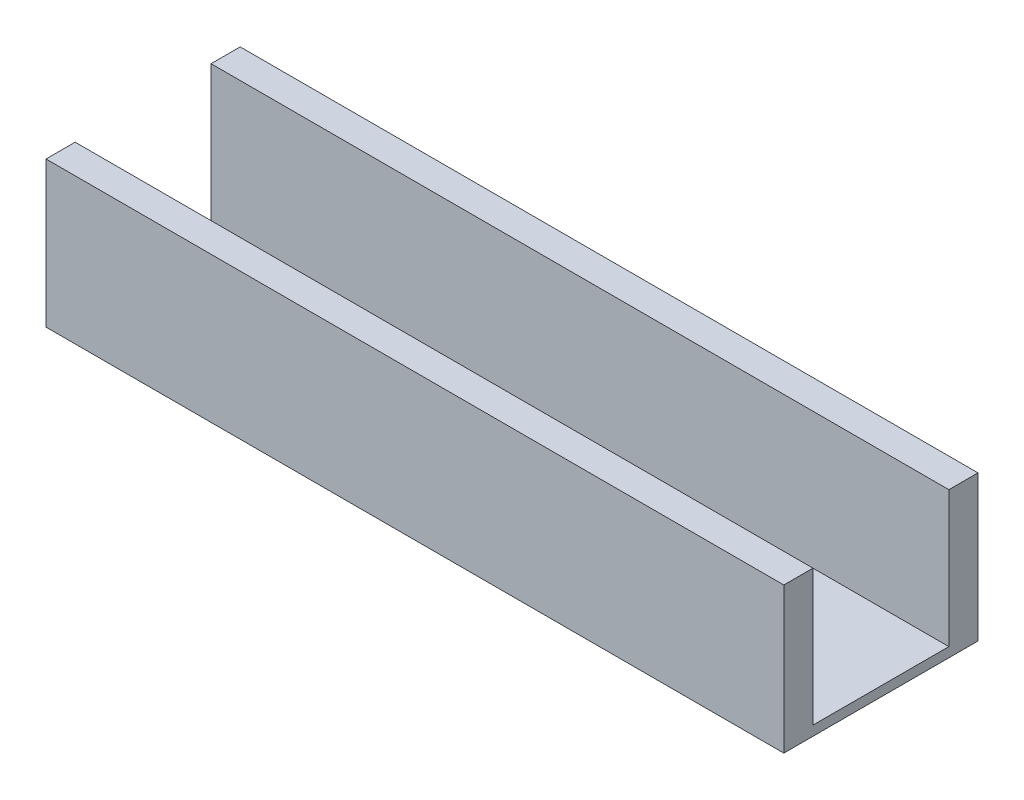
ISO-10303-21;
HEADER;
FILE_DESCRIPTION(('STEP AP214'),'2;1');
FILE_NAME('part.step','',(''),(''),'','','');
FILE_SCHEMA(('AUTOMOTIVE_DESIGN { 1 0 10303 214 1 1 1 1 }'));
ENDSEC;
DATA;
#1=APPLICATION_CONTEXT('core data for automotive mechanical design processes');
#2=APPLICATION_PROTOCOL_DEFINITION('international standard','automotive_design',2000,#1);
#3=PRODUCT_CONTEXT('',#1,'mechanical');
#4=PRODUCT('Part','Part','',(#3));
#5=PRODUCT_RELATED_PRODUCT_CATEGORY('part','',(#4));
#6=PRODUCT_DEFINITION_FORMATION('','',#4);
#7=PRODUCT_DEFINITION_CONTEXT('part definition',#1,'design');
#8=PRODUCT_DEFINITION('design','',#6,#7);
#9=PRODUCT_DEFINITION_SHAPE('','',#8);
#10=(LENGTH_UNIT() NAMED_UNIT(*) SI_UNIT(.MILLI.,.METRE.));
#11=(NAMED_UNIT(*) PLANE_ANGLE_UNIT() SI_UNIT($,.RADIAN.));
#12=(NAMED_UNIT(*) SI_UNIT($,.STERADIAN.) SOLID_ANGLE_UNIT());
#13=UNCERTAINTY_MEASURE_WITH_UNIT(LENGTH_MEASURE(1.E-05),#10,'distance_accuracy_value','');
#14=(GEOMETRIC_REPRESENTATION_CONTEXT(3) GLOBAL_UNCERTAINTY_ASSIGNED_CONTEXT((#13)) GLOBAL_UNIT_ASSIGNED_CONTEXT((#10,
#11,#12)) REPRESENTATION_CONTEXT('',''));
#15=CARTESIAN_POINT('',(0.,0.,0.));
#16=DIRECTION('',(0.,0.,1.));
#17=DIRECTION('',(1.,0.,0.));
#18=AXIS2_PLACEMENT_3D('',#15,#16,#17);
#19=CARTESIAN_POINT('',(0.,6.35,0.));
#20=DIRECTION('',(0.,-1.,0.));
#21=DIRECTION('',(0.,0.,-1.));
#22=AXIS2_PLACEMENT_3D('',#19,#20,#21);
#23=PLANE('',#22);
#24=DIRECTION('',(1.,0.,0.));
#25=VECTOR('',#24,1.);
#26=CARTESIAN_POINT('',(0.,6.35,-107.95));
#27=LINE('',#26,#25);
#28=CARTESIAN_POINT('',(0.,6.35,-107.95));
#29=VERTEX_POINT('',#28);
#30=CARTESIAN_POINT('',(482.6,6.35,-107.95));
#31=VERTEX_POINT('',#30);
#32=EDGE_CURVE('E122',#29,#31,#27,.T.);
#33=ORIENTED_EDGE('',*,*,#32,.F.);
#34=DIRECTION('',(0.,0.,1.));
#35=VECTOR('',#34,1.);
#36=CARTESIAN_POINT('',(0.,6.35,0.));
#37=LINE('',#36,#35);
#38=CARTESIAN_POINT('',(0.,6.35,-19.05));
#39=VERTEX_POINT('',#38);
#40=EDGE_CURVE('E126',#29,#39,#37,.T.);
#41=ORIENTED_EDGE('',*,*,#40,.T.);
#42=DIRECTION('',(-1.,0.,0.));
#43=VECTOR('',#42,1.);
#44=CARTESIAN_POINT('',(0.,6.35,-19.05));
#45=LINE('',#44,#43);
#46=CARTESIAN_POINT('',(482.6,6.35,-19.05));
#47=VERTEX_POINT('',#46);
#48=EDGE_CURVE('E58',#47,#39,#45,.T.);
#49=ORIENTED_EDGE('',*,*,#48,.F.);
#50=DIRECTION('',(0.,0.,-1.));
#51=VECTOR('',#50,1.);
#52=CARTESIAN_POINT('',(482.6,6.35,-127.));
#53=LINE('',#52,#51);
#54=EDGE_CURVE('E53',#47,#31,#53,.T.);
#55=ORIENTED_EDGE('',*,*,#54,.T.);
#56=EDGE_LOOP('',(#33,#41,#49,#55));
#57=FACE_BOUND('',#56,.T.);
#58=ADVANCED_FACE('F38',(#57),#23,.F.);
#59=CARTESIAN_POINT('',(482.6,6.35,0.));
#60=DIRECTION('',(0.,0.,-1.));
#61=DIRECTION('',(-1.,0.,0.));
#62=AXIS2_PLACEMENT_3D('',#59,#60,#61);
#63=PLANE('',#62);
#64=DIRECTION('',(1.,0.,0.));
#65=VECTOR('',#64,1.);
#66=CARTESIAN_POINT('',(482.6,0.,0.));
#67=LINE('',#66,#65);
#68=CARTESIAN_POINT('',(0.,0.,0.));
#69=VERTEX_POINT('',#68);
#70=CARTESIAN_POINT('',(482.6,0.,0.));
#71=VERTEX_POINT('',#70);
#72=EDGE_CURVE('E147',#69,#71,#67,.T.);
#73=ORIENTED_EDGE('',*,*,#72,.T.);
#74=DIRECTION('',(0.,-1.,0.));
#75=VECTOR('',#74,1.);
#76=CARTESIAN_POINT('',(482.6,6.35,0.));
#77=LINE('',#76,#75);
#78=CARTESIAN_POINT('',(482.6,95.25,0.));
#79=VERTEX_POINT('',#78);
#80=EDGE_CURVE('E11',#79,#71,#77,.T.);
#81=ORIENTED_EDGE('',*,*,#80,.F.);
#82=DIRECTION('',(1.,0.,0.));
#83=VECTOR('',#82,1.);
#84=CARTESIAN_POINT('',(0.,95.25,0.));
#85=LINE('',#84,#83);
#86=CARTESIAN_POINT('',(0.,95.25,0.));
#87=VERTEX_POINT('',#86);
#88=EDGE_CURVE('E135',#87,#79,#85,.T.);
#89=ORIENTED_EDGE('',*,*,#88,.F.);
#90=DIRECTION('',(0.,-1.,0.));
#91=VECTOR('',#90,1.);
#92=CARTESIAN_POINT('',(0.,6.35,0.));
#93=LINE('',#92,#91);
#94=EDGE_CURVE('E151',#87,#69,#93,.T.);
#95=ORIENTED_EDGE('',*,*,#94,.T.);
#96=EDGE_LOOP('',(#73,#81,#89,#95));
#97=FACE_BOUND('',#96,.T.);
#98=ADVANCED_FACE('F40',(#97),#63,.F.);
#99=CARTESIAN_POINT('',(482.6,6.35,-127.));
#100=DIRECTION('',(-1.,0.,0.));
#101=DIRECTION('',(0.,0.,1.));
#102=AXIS2_PLACEMENT_3D('',#99,#100,#101);
#103=PLANE('',#102);
#104=DIRECTION('',(0.,0.,-1.));
#105=VECTOR('',#104,1.);
#106=CARTESIAN_POINT('',(482.6,0.,-127.));
#107=LINE('',#106,#105);
#108=CARTESIAN_POINT('',(482.6,0.,-127.));
#109=VERTEX_POINT('',#108);
#110=EDGE_CURVE('E154',#71,#109,#107,.T.);
#111=ORIENTED_EDGE('',*,*,#110,.T.);
#112=DIRECTION('',(0.,-1.,0.));
#113=VECTOR('',#112,1.);
#114=CARTESIAN_POINT('',(482.6,6.35,-127.));
#115=LINE('',#114,#113);
#116=CARTESIAN_POINT('',(482.6,95.25,-127.));
#117=VERTEX_POINT('',#116);
#118=EDGE_CURVE('E46',#117,#109,#115,.T.);
#119=ORIENTED_EDGE('',*,*,#118,.F.);
#120=DIRECTION('',(0.,0.,-1.));
#121=VECTOR('',#120,1.);
#122=CARTESIAN_POINT('',(482.6,95.25,-127.));
#123=LINE('',#122,#121);
#124=CARTESIAN_POINT('',(482.6,95.25,-107.95));
#125=VERTEX_POINT('',#124);
#126=EDGE_CURVE('E112',#125,#117,#123,.T.);
#127=ORIENTED_EDGE('',*,*,#126,.F.);
#128=DIRECTION('',(0.,-1.,0.));
#129=VECTOR('',#128,1.);
#130=CARTESIAN_POINT('',(482.6,95.25,-107.95));
#131=LINE('',#130,#129);
#132=EDGE_CURVE('E108',#125,#31,#131,.T.);
#133=ORIENTED_EDGE('',*,*,#132,.T.);
#134=ORIENTED_EDGE('',*,*,#54,.F.);
#135=DIRECTION('',(0.,-1.,0.));
#136=VECTOR('',#135,1.);
#137=CARTESIAN_POINT('',(482.6,95.25,-19.05));
#138=LINE('',#137,#136);
#139=CARTESIAN_POINT('',(482.6,95.25,-19.05));
#140=VERTEX_POINT('',#139);
#141=EDGE_CURVE('E144',#140,#47,#138,.T.);
#142=ORIENTED_EDGE('',*,*,#141,.F.);
#143=DIRECTION('',(0.,0.,-1.));
#144=VECTOR('',#143,1.);
#145=CARTESIAN_POINT('',(482.6,95.25,0.));
#146=LINE('',#145,#144);
#147=EDGE_CURVE('E138',#79,#140,#146,.T.);
#148=ORIENTED_EDGE('',*,*,#147,.F.);
#149=ORIENTED_EDGE('',*,*,#80,.T.);
#150=EDGE_LOOP('',(#111,#119,#127,#133,#134,#142,#148,#149));
#151=FACE_BOUND('',#150,.T.);
#152=ADVANCED_FACE('F182',(#151),#103,.F.);
#153=CARTESIAN_POINT('',(0.,6.35,-127.));
#154=DIRECTION('',(0.,0.,1.));
#155=DIRECTION('',(1.,0.,0.));
#156=AXIS2_PLACEMENT_3D('',#153,#154,#155);
#157=PLANE('',#156);
#158=DIRECTION('',(-1.,0.,0.));
#159=VECTOR('',#158,1.);
#160=CARTESIAN_POINT('',(0.,0.,-127.));
#161=LINE('',#160,#159);
#162=CARTESIAN_POINT('',(0.,0.,-127.));
#163=VERTEX_POINT('',#162);
#164=EDGE_CURVE('E156',#109,#163,#161,.T.);
#165=ORIENTED_EDGE('',*,*,#164,.T.);
#166=DIRECTION('',(0.,-1.,0.));
#167=VECTOR('',#166,1.);
#168=CARTESIAN_POINT('',(0.,6.35,-127.));
#169=LINE('',#168,#167);
#170=CARTESIAN_POINT('',(0.,95.25,-127.));
#171=VERTEX_POINT('',#170);
#172=EDGE_CURVE('E161',#171,#163,#169,.T.);
#173=ORIENTED_EDGE('',*,*,#172,.F.);
#174=DIRECTION('',(-1.,0.,0.));
#175=VECTOR('',#174,1.);
#176=CARTESIAN_POINT('',(0.,95.25,-127.));
#177=LINE('',#176,#175);
#178=EDGE_CURVE('E119',#117,#171,#177,.T.);
#179=ORIENTED_EDGE('',*,*,#178,.F.);
#180=ORIENTED_EDGE('',*,*,#118,.T.);
#181=EDGE_LOOP('',(#165,#173,#179,#180));
#182=FACE_BOUND('',#181,.T.);
#183=ADVANCED_FACE('F165',(#182),#157,.F.);
#184=CARTESIAN_POINT('',(0.,6.35,0.));
#185=DIRECTION('',(1.,0.,0.));
#186=DIRECTION('',(0.,0.,-1.));
#187=AXIS2_PLACEMENT_3D('',#184,#185,#186);
#188=PLANE('',#187);
#189=DIRECTION('',(0.,0.,1.));
#190=VECTOR('',#189,1.);
#191=CARTESIAN_POINT('',(0.,0.,0.));
#192=LINE('',#191,#190);
#193=EDGE_CURVE('E149',#163,#69,#192,.T.);
#194=ORIENTED_EDGE('',*,*,#193,.T.);
#195=ORIENTED_EDGE('',*,*,#94,.F.);
#196=DIRECTION('',(0.,0.,1.));
#197=VECTOR('',#196,1.);
#198=CARTESIAN_POINT('',(0.,95.25,0.));
#199=LINE('',#198,#197);
#200=CARTESIAN_POINT('',(0.,95.25,-19.05));
#201=VERTEX_POINT('',#200);
#202=EDGE_CURVE('E128',#201,#87,#199,.T.);
#203=ORIENTED_EDGE('',*,*,#202,.F.);
#204=DIRECTION('',(0.,-1.,0.));
#205=VECTOR('',#204,1.);
#206=CARTESIAN_POINT('',(0.,95.25,-19.05));
#207=LINE('',#206,#205);
#208=EDGE_CURVE('E141',#201,#39,#207,.T.);
#209=ORIENTED_EDGE('',*,*,#208,.T.);
#210=ORIENTED_EDGE('',*,*,#40,.F.);
#211=DIRECTION('',(0.,-1.,0.));
#212=VECTOR('',#211,1.);
#213=CARTESIAN_POINT('',(0.,95.25,-107.95));
#214=LINE('',#213,#212);
#215=CARTESIAN_POINT('',(0.,95.25,-107.95));
#216=VERTEX_POINT('',#215);
#217=EDGE_CURVE('E106',#216,#29,#214,.T.);
#218=ORIENTED_EDGE('',*,*,#217,.F.);
#219=DIRECTION('',(0.,0.,1.));
#220=VECTOR('',#219,1.);
#221=CARTESIAN_POINT('',(0.,95.25,-127.));
#222=LINE('',#221,#220);
#223=EDGE_CURVE('E113',#171,#216,#222,.T.);
#224=ORIENTED_EDGE('',*,*,#223,.F.);
#225=ORIENTED_EDGE('',*,*,#172,.T.);
#226=EDGE_LOOP('',(#194,#195,#203,#209,#210,#218,#224,#225));
#227=FACE_BOUND('',#226,.T.);
#228=ADVANCED_FACE('F124',(#227),#188,.F.);
#229=CARTESIAN_POINT('',(0.,0.,0.));
#230=DIRECTION('',(0.,-1.,0.));
#231=DIRECTION('',(0.,0.,-1.));
#232=AXIS2_PLACEMENT_3D('',#229,#230,#231);
#233=PLANE('',#232);
#234=ORIENTED_EDGE('',*,*,#72,.F.);
#235=ORIENTED_EDGE('',*,*,#193,.F.);
#236=ORIENTED_EDGE('',*,*,#164,.F.);
#237=ORIENTED_EDGE('',*,*,#110,.F.);
#238=EDGE_LOOP('',(#234,#235,#236,#237));
#239=FACE_BOUND('',#238,.T.);
#240=ADVANCED_FACE('F170',(#239),#233,.T.);
#241=CARTESIAN_POINT('',(0.,95.25,-19.05));
#242=DIRECTION('',(0.,0.,1.));
#243=DIRECTION('',(1.,0.,0.));
#244=AXIS2_PLACEMENT_3D('',#241,#242,#243);
#245=PLANE('',#244);
#246=ORIENTED_EDGE('',*,*,#48,.T.);
#247=ORIENTED_EDGE('',*,*,#208,.F.);
#248=DIRECTION('',(-1.,0.,0.));
#249=VECTOR('',#248,1.);
#250=CARTESIAN_POINT('',(0.,95.25,-19.05));
#251=LINE('',#250,#249);
#252=EDGE_CURVE('E140',#140,#201,#251,.T.);
#253=ORIENTED_EDGE('',*,*,#252,.F.);
#254=ORIENTED_EDGE('',*,*,#141,.T.);
#255=EDGE_LOOP('',(#246,#247,#253,#254));
#256=FACE_BOUND('',#255,.T.);
#257=ADVANCED_FACE('F180',(#256),#245,.F.);
#258=CARTESIAN_POINT('',(0.,95.25,0.));
#259=DIRECTION('',(0.,-1.,0.));
#260=DIRECTION('',(0.,0.,-1.));
#261=AXIS2_PLACEMENT_3D('',#258,#259,#260);
#262=PLANE('',#261);
#263=ORIENTED_EDGE('',*,*,#202,.T.);
#264=ORIENTED_EDGE('',*,*,#88,.T.);
#265=ORIENTED_EDGE('',*,*,#147,.T.);
#266=ORIENTED_EDGE('',*,*,#252,.T.);
#267=EDGE_LOOP('',(#263,#264,#265,#266));
#268=FACE_BOUND('',#267,.T.);
#269=ADVANCED_FACE('F176',(#268),#262,.F.);
#270=CARTESIAN_POINT('',(0.,95.25,-107.95));
#271=DIRECTION('',(0.,0.,-1.));
#272=DIRECTION('',(-1.,0.,0.));
#273=AXIS2_PLACEMENT_3D('',#270,#271,#272);
#274=PLANE('',#273);
#275=ORIENTED_EDGE('',*,*,#32,.T.);
#276=ORIENTED_EDGE('',*,*,#132,.F.);
#277=DIRECTION('',(1.,0.,0.));
#278=VECTOR('',#277,1.);
#279=CARTESIAN_POINT('',(0.,95.25,-107.95));
#280=LINE('',#279,#278);
#281=EDGE_CURVE('E102',#216,#125,#280,.T.);
#282=ORIENTED_EDGE('',*,*,#281,.F.);
#283=ORIENTED_EDGE('',*,*,#217,.T.);
#284=EDGE_LOOP('',(#275,#276,#282,#283));
#285=FACE_BOUND('',#284,.T.);
#286=ADVANCED_FACE('F104',(#285),#274,.F.);
#287=CARTESIAN_POINT('',(0.,95.25,0.));
#288=DIRECTION('',(0.,1.,0.));
#289=DIRECTION('',(0.,0.,1.));
#290=AXIS2_PLACEMENT_3D('',#287,#288,#289);
#291=PLANE('',#290);
#292=ORIENTED_EDGE('',*,*,#223,.T.);
#293=ORIENTED_EDGE('',*,*,#281,.T.);
#294=ORIENTED_EDGE('',*,*,#126,.T.);
#295=ORIENTED_EDGE('',*,*,#178,.T.);
#296=EDGE_LOOP('',(#292,#293,#294,#295));
#297=FACE_BOUND('',#296,.T.);
#298=ADVANCED_FACE('F117',(#297),#291,.T.);
#299=CLOSED_SHELL('',(#58,#98,#152,#183,#228,#240,#257,#269,#286,#298));
#300=MANIFOLD_SOLID_BREP('B2',#299);
#301=ADVANCED_BREP_SHAPE_REPRESENTATION('',(#18,#300),#14);
#302=SHAPE_DEFINITION_REPRESENTATION(#9,#301);
ENDSEC;
END-ISO-10303-21;
